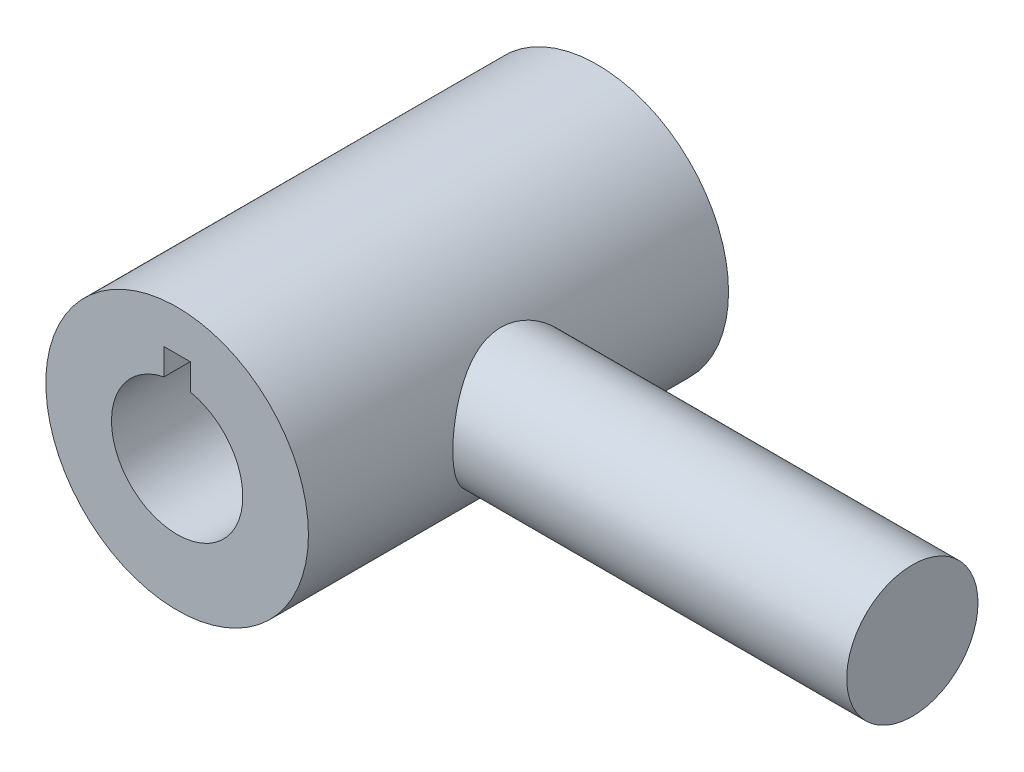
ISO-10303-21;
HEADER;
FILE_DESCRIPTION(('STEP AP214'),'2;1');
FILE_NAME('part.step','',(''),(''),'','','');
FILE_SCHEMA(('AUTOMOTIVE_DESIGN { 1 0 10303 214 1 1 1 1 }'));
ENDSEC;
DATA;
#1=APPLICATION_CONTEXT('core data for automotive mechanical design processes');
#2=APPLICATION_PROTOCOL_DEFINITION('international standard','automotive_design',2000,#1);
#3=PRODUCT_CONTEXT('',#1,'mechanical');
#4=PRODUCT('Part','Part','',(#3));
#5=PRODUCT_RELATED_PRODUCT_CATEGORY('part','',(#4));
#6=PRODUCT_DEFINITION_FORMATION('','',#4);
#7=PRODUCT_DEFINITION_CONTEXT('part definition',#1,'design');
#8=PRODUCT_DEFINITION('design','',#6,#7);
#9=PRODUCT_DEFINITION_SHAPE('','',#8);
#10=(LENGTH_UNIT() NAMED_UNIT(*) SI_UNIT(.MILLI.,.METRE.));
#11=(NAMED_UNIT(*) PLANE_ANGLE_UNIT() SI_UNIT($,.RADIAN.));
#12=(NAMED_UNIT(*) SI_UNIT($,.STERADIAN.) SOLID_ANGLE_UNIT());
#13=UNCERTAINTY_MEASURE_WITH_UNIT(LENGTH_MEASURE(1.E-05),#10,'distance_accuracy_value','');
#14=(GEOMETRIC_REPRESENTATION_CONTEXT(3) GLOBAL_UNCERTAINTY_ASSIGNED_CONTEXT((#13)) GLOBAL_UNIT_ASSIGNED_CONTEXT((#10,
#11,#12)) REPRESENTATION_CONTEXT('',''));
#15=CARTESIAN_POINT('',(0.,0.,0.));
#16=DIRECTION('',(0.,0.,1.));
#17=DIRECTION('',(1.,0.,0.));
#18=AXIS2_PLACEMENT_3D('',#15,#16,#17);
#19=CARTESIAN_POINT('',(0.,0.,10.16));
#20=DIRECTION('',(0.,0.,1.));
#21=DIRECTION('',(1.,0.,0.));
#22=AXIS2_PLACEMENT_3D('',#19,#20,#21);
#23=PLANE('',#22);
#24=CARTESIAN_POINT('',(0.,0.,10.16));
#25=DIRECTION('',(0.,0.,1.));
#26=DIRECTION('',(1.,0.,0.));
#27=AXIS2_PLACEMENT_3D('',#24,#25,#26);
#28=CIRCLE('',#27,6.35);
#29=CARTESIAN_POINT('',(6.35,0.,10.16));
#30=VERTEX_POINT('',#29);
#31=EDGE_CURVE('E11',#30,#30,#28,.T.);
#32=ORIENTED_EDGE('',*,*,#31,.T.);
#33=EDGE_LOOP('',(#32));
#34=FACE_BOUND('',#33,.T.);
#35=DIRECTION('',(0.,1.,0.));
#36=VECTOR('',#35,1.);
#37=CARTESIAN_POINT('',(0.635,4.38085197333464,10.16));
#38=LINE('',#37,#36);
#39=CARTESIAN_POINT('',(0.635,3.11085197333464,10.16));
#40=VERTEX_POINT('',#39);
#41=CARTESIAN_POINT('',(0.635,4.38085197333464,10.16));
#42=VERTEX_POINT('',#41);
#43=EDGE_CURVE('E100',#40,#42,#38,.T.);
#44=ORIENTED_EDGE('',*,*,#43,.F.);
#45=CARTESIAN_POINT('',(0.,0.,10.16));
#46=DIRECTION('',(0.,0.,1.));
#47=DIRECTION('',(1.,0.,0.));
#48=AXIS2_PLACEMENT_3D('',#45,#46,#47);
#49=CIRCLE('',#48,3.175);
#50=CARTESIAN_POINT('',(-0.635,3.11085197333464,10.16));
#51=VERTEX_POINT('',#50);
#52=EDGE_CURVE('E91',#51,#40,#49,.T.);
#53=ORIENTED_EDGE('',*,*,#52,.F.);
#54=DIRECTION('',(0.,-1.,0.));
#55=VECTOR('',#54,1.);
#56=CARTESIAN_POINT('',(-0.635,3.11085197333464,10.16));
#57=LINE('',#56,#55);
#58=CARTESIAN_POINT('',(-0.635,4.38085197333464,10.16));
#59=VERTEX_POINT('',#58);
#60=EDGE_CURVE('E118',#59,#51,#57,.T.);
#61=ORIENTED_EDGE('',*,*,#60,.F.);
#62=DIRECTION('',(-1.,0.,0.));
#63=VECTOR('',#62,1.);
#64=CARTESIAN_POINT('',(-0.635,4.38085197333464,10.16));
#65=LINE('',#64,#63);
#66=EDGE_CURVE('E112',#42,#59,#65,.T.);
#67=ORIENTED_EDGE('',*,*,#66,.F.);
#68=EDGE_LOOP('',(#44,#53,#61,#67));
#69=FACE_BOUND('',#68,.T.);
#70=ADVANCED_FACE('F49',(#34,#69),#23,.T.);
#71=CARTESIAN_POINT('',(0.,0.,-10.16));
#72=DIRECTION('',(0.,0.,1.));
#73=DIRECTION('',(1.,0.,0.));
#74=AXIS2_PLACEMENT_3D('',#71,#72,#73);
#75=PLANE('',#74);
#76=CARTESIAN_POINT('',(0.,0.,-10.16));
#77=DIRECTION('',(0.,0.,1.));
#78=DIRECTION('',(1.,0.,0.));
#79=AXIS2_PLACEMENT_3D('',#76,#77,#78);
#80=CIRCLE('',#79,6.35);
#81=CARTESIAN_POINT('',(6.35,0.,-10.16));
#82=VERTEX_POINT('',#81);
#83=EDGE_CURVE('E53',#82,#82,#80,.T.);
#84=ORIENTED_EDGE('',*,*,#83,.F.);
#85=EDGE_LOOP('',(#84));
#86=FACE_BOUND('',#85,.T.);
#87=CARTESIAN_POINT('',(0.,0.,-10.16));
#88=DIRECTION('',(0.,0.,1.));
#89=DIRECTION('',(1.,0.,0.));
#90=AXIS2_PLACEMENT_3D('',#87,#88,#89);
#91=CIRCLE('',#90,3.175);
#92=CARTESIAN_POINT('',(-0.635,3.11085197333464,-10.16));
#93=VERTEX_POINT('',#92);
#94=CARTESIAN_POINT('',(0.635,3.11085197333464,-10.16));
#95=VERTEX_POINT('',#94);
#96=EDGE_CURVE('E73',#93,#95,#91,.T.);
#97=ORIENTED_EDGE('',*,*,#96,.T.);
#98=DIRECTION('',(0.,1.,0.));
#99=VECTOR('',#98,1.);
#100=CARTESIAN_POINT('',(0.635,4.38085197333464,-10.16));
#101=LINE('',#100,#99);
#102=CARTESIAN_POINT('',(0.635,4.38085197333464,-10.16));
#103=VERTEX_POINT('',#102);
#104=EDGE_CURVE('E107',#95,#103,#101,.T.);
#105=ORIENTED_EDGE('',*,*,#104,.T.);
#106=DIRECTION('',(-1.,0.,0.));
#107=VECTOR('',#106,1.);
#108=CARTESIAN_POINT('',(-0.635,4.38085197333464,-10.16));
#109=LINE('',#108,#107);
#110=CARTESIAN_POINT('',(-0.635,4.38085197333464,-10.16));
#111=VERTEX_POINT('',#110);
#112=EDGE_CURVE('E129',#103,#111,#109,.T.);
#113=ORIENTED_EDGE('',*,*,#112,.T.);
#114=DIRECTION('',(0.,-1.,0.));
#115=VECTOR('',#114,1.);
#116=CARTESIAN_POINT('',(-0.635,3.11085197333464,-10.16));
#117=LINE('',#116,#115);
#118=EDGE_CURVE('E101',#111,#93,#117,.T.);
#119=ORIENTED_EDGE('',*,*,#118,.T.);
#120=EDGE_LOOP('',(#97,#105,#113,#119));
#121=FACE_BOUND('',#120,.T.);
#122=ADVANCED_FACE('F147',(#86,#121),#75,.F.);
#123=CARTESIAN_POINT('',(0.,0.,10.16));
#124=DIRECTION('',(0.,0.,-1.));
#125=DIRECTION('',(-1.,0.,0.));
#126=AXIS2_PLACEMENT_3D('',#123,#124,#125);
#127=CYLINDRICAL_SURFACE('',#126,6.35);
#128=CARTESIAN_POINT('',(6.35,0.,-3.175));
#129=CARTESIAN_POINT('',(6.34999931166444,0.0834969220594998,-3.17499911228237));
#130=CARTESIAN_POINT('',(6.34834758911701,0.167002655580042,-3.17170012555405));
#131=CARTESIAN_POINT('',(6.34179105821714,0.333378330258781,-3.15855412545011));
#132=CARTESIAN_POINT('',(6.33688483467113,0.416247978955771,-3.14870426347423));
#133=CARTESIAN_POINT('',(6.31742426748325,0.66318203064701,-3.10942793495399));
#134=CARTESIAN_POINT('',(6.29812827299425,0.825450146761554,-3.0702749225986));
#135=CARTESIAN_POINT('',(6.2489182313574,1.13965128900426,-2.96800928870585));
#136=CARTESIAN_POINT('',(6.21904547786825,1.29162180811868,-2.90498978075659));
#137=CARTESIAN_POINT('',(6.15142812041637,1.58264035037879,-2.7572639263711));
#138=CARTESIAN_POINT('',(6.11368413715877,1.72168939123018,-2.67255928984904));
#139=CARTESIAN_POINT('',(6.03111096182982,1.99234108848171,-2.47803037026578));
#140=CARTESIAN_POINT('',(5.98599127270818,2.12298433900091,-2.36699642220607));
#141=CARTESIAN_POINT('',(5.89470535591056,2.36467069069853,-2.12560331642721));
#142=CARTESIAN_POINT('',(5.84853836069043,2.47569885601321,-1.99522957023356));
#143=CARTESIAN_POINT('',(5.75623634934464,2.68368848497886,-1.70657905224669));
#144=CARTESIAN_POINT('',(5.71038146176788,2.77889135161934,-1.54692246869841));
#145=CARTESIAN_POINT('',(5.64919759286363,2.90019349951534,-1.29545201282557));
#146=CARTESIAN_POINT('',(5.63006420805933,2.93705266116892,-1.20959993817132));
#147=CARTESIAN_POINT('',(5.59504604853267,3.00322508739606,-1.03441438629358));
#148=CARTESIAN_POINT('',(5.57915935583429,3.03254280972159,-0.945083001819447));
#149=CARTESIAN_POINT('',(5.55212611635049,3.08174263292982,-0.768989448035257));
#150=CARTESIAN_POINT('',(5.54075429137746,3.10208128111978,-0.682389205971436));
#151=CARTESIAN_POINT('',(5.52193654886444,3.13545600360765,-0.507412721005601));
#152=CARTESIAN_POINT('',(5.51448854851135,3.14849595237257,-0.419037446228298));
#153=CARTESIAN_POINT('',(5.50383875782918,3.1670771305344,-0.241293261151383));
#154=CARTESIAN_POINT('',(5.50063441026522,3.1726228759965,-0.151924982012601));
#155=CARTESIAN_POINT('',(5.49859788398609,3.17614778806993,0.0269807841780854));
#156=CARTESIAN_POINT('',(5.49976528812799,3.17412767659872,0.116518254271338));
#157=CARTESIAN_POINT('',(5.50899190362733,3.1581193033026,0.362747875724405));
#158=CARTESIAN_POINT('',(5.52160857357707,3.13621253452965,0.518841729813365));
#159=CARTESIAN_POINT('',(5.55866493052824,3.07003746372168,0.82464664130653));
#160=CARTESIAN_POINT('',(5.58310838358077,3.02576203854504,0.974355649022765));
#161=CARTESIAN_POINT('',(5.64157885407237,2.91531509833647,1.26754429656414));
#162=CARTESIAN_POINT('',(5.67581583876129,2.84865758129418,1.41079760993662));
#163=CARTESIAN_POINT('',(5.75003268807633,2.69570761526054,1.68476608617402));
#164=CARTESIAN_POINT('',(5.79001512927804,2.60940634674629,1.81547557960851));
#165=CARTESIAN_POINT('',(5.87734289018611,2.40685964249565,2.07810427425029));
#166=CARTESIAN_POINT('',(5.92497898403936,2.28820488335253,2.20807538485651));
#167=CARTESIAN_POINT('',(6.01813700574905,2.03058898448427,2.44708514286384));
#168=CARTESIAN_POINT('',(6.06365791538158,1.89161819563546,2.5561137863587));
#169=CARTESIAN_POINT('',(6.1500381059768,1.58913989972483,2.75490191971972));
#170=CARTESIAN_POINT('',(6.19058274974572,1.42479265164789,2.84353148557994));
#171=CARTESIAN_POINT('',(6.25976272299952,1.08098023585583,2.99115808163535));
#172=CARTESIAN_POINT('',(6.28840750578946,0.901527205073897,3.05017864113171));
#173=CARTESIAN_POINT('',(6.32854759690358,0.548533610626835,3.13205940339905));
#174=CARTESIAN_POINT('',(6.34126679122995,0.375734359385247,3.15750967258734));
#175=CARTESIAN_POINT('',(6.35231817716325,0.0278752299448336,3.17965052226026));
#176=CARTESIAN_POINT('',(6.35065718436129,-0.147183538060017,3.17635472713932));
#177=CARTESIAN_POINT('',(6.33384535408399,-0.480164686080361,3.14259376405461));
#178=CARTESIAN_POINT('',(6.31975005060431,-0.638363620564188,3.11425420852516));
#179=CARTESIAN_POINT('',(6.28085393924121,-0.947441883052999,3.03454412179011));
#180=CARTESIAN_POINT('',(6.25605195113515,-1.09832040207141,2.98317105152272));
#181=CARTESIAN_POINT('',(6.19709998236334,-1.39347133182512,2.8575048690622));
#182=CARTESIAN_POINT('',(6.16270299610717,-1.53743151047822,2.78259841588881));
#183=CARTESIAN_POINT('',(6.08787118465664,-1.8112148234104,2.61268357431413));
#184=CARTESIAN_POINT('',(6.0474337895468,-1.94103189959927,2.5176666226146));
#185=CARTESIAN_POINT('',(5.95973602709939,-2.19636241342679,2.29946064962623));
#186=CARTESIAN_POINT('',(5.91219559251098,-2.3202013468198,2.17442139288844));
#187=CARTESIAN_POINT('',(5.81858093231368,-2.54589381918874,1.90523764485025));
#188=CARTESIAN_POINT('',(5.77250773963547,-2.6477321493525,1.76108004761907));
#189=CARTESIAN_POINT('',(5.68487535288742,-2.83117262876716,1.44893139804165));
#190=CARTESIAN_POINT('',(5.64364281441821,-2.91155594998014,1.28012423048962));
#191=CARTESIAN_POINT('',(5.5744767953732,-3.04191297152938,0.928655535110328));
#192=CARTESIAN_POINT('',(5.54652618900869,-3.0919258549222,0.746012202152618));
#193=CARTESIAN_POINT('',(5.51057765714603,-3.15551086037918,0.390810043529835));
#194=CARTESIAN_POINT('',(5.50092192343245,-3.17212027309711,0.218966249592789));
#195=CARTESIAN_POINT('',(5.49800001145358,-3.17718805563876,-0.125244442495203));
#196=CARTESIAN_POINT('',(5.5047267290444,-3.16565862768386,-0.297611081542637));
#197=CARTESIAN_POINT('',(5.53205211477784,-3.11761548073658,-0.620660103073908));
#198=CARTESIAN_POINT('',(5.55126823076269,-3.08358651207686,-0.771843941731147));
#199=CARTESIAN_POINT('',(5.59977978302582,-2.99458164828807,-1.06619083016717));
#200=CARTESIAN_POINT('',(5.62907846127335,-2.93959901505999,-1.2093512828503));
#201=CARTESIAN_POINT('',(5.69685576337174,-2.8061154442137,-1.49423369942854));
#202=CARTESIAN_POINT('',(5.73581889480533,-2.72628260503929,-1.63521280936567));
#203=CARTESIAN_POINT('',(5.81772207082382,-2.54682759156583,-1.9026974317231));
#204=CARTESIAN_POINT('',(5.8606641782013,-2.44719512169931,-2.02919535994271));
#205=CARTESIAN_POINT('',(5.95192753761203,-2.21680287661219,-2.28009752417706));
#206=CARTESIAN_POINT('',(6.00026839877346,-2.08373188558712,-2.40237975641279));
#207=CARTESIAN_POINT('',(6.0921234557675,-1.79751265125244,-2.62339787323312));
#208=CARTESIAN_POINT('',(6.13563504323042,-1.64435365457428,-2.72212106598272));
#209=CARTESIAN_POINT('',(6.19391073190243,-1.40178715704487,-2.85028026619707));
#210=CARTESIAN_POINT('',(6.21223173271383,-1.31842200030918,-2.88980058368139));
#211=CARTESIAN_POINT('',(6.24595363475604,-1.1480770102167,-2.9615994748237));
#212=CARTESIAN_POINT('',(6.26135597012704,-1.06109897786306,-2.99388160653437));
#213=CARTESIAN_POINT('',(6.28875097111981,-0.884361322813109,-3.050759345915));
#214=CARTESIAN_POINT('',(6.30075106809478,-0.794608244970573,-3.07537171813811));
#215=CARTESIAN_POINT('',(6.32100983571903,-0.612925661591583,-3.11666738952989));
#216=CARTESIAN_POINT('',(6.3292707916836,-0.520997521680291,-3.13335553219354));
#217=CARTESIAN_POINT('',(6.34032503263334,-0.357531347524374,-3.15561628486239));
#218=CARTESIAN_POINT('',(6.34394670812889,-0.286274046488595,-3.16287882124963));
#219=CARTESIAN_POINT('',(6.34878452045567,-0.143346668941345,-3.17257112653757));
#220=CARTESIAN_POINT('',(6.35000059089052,-0.0716765810914251,-3.17500076204683));
#221=CARTESIAN_POINT('',(6.35,0.,-3.175));
#222=B_SPLINE_CURVE_WITH_KNOTS('',3,(#128,#129,#130,#131,#132,#133,#134,#135,#136,#137,#138,
#139,#140,#141,#142,#143,#144,#145,#146,#147,#148,#149,#150,#151,#152,#153,#154,#155,#156,#157,
#158,#159,#160,#161,#162,#163,#164,#165,#166,#167,#168,#169,#170,#171,#172,#173,#174,#175,#176,
#177,#178,#179,#180,#181,#182,#183,#184,#185,#186,#187,#188,#189,#190,#191,#192,#193,#194,#195,
#196,#197,#198,#199,#200,#201,#202,#203,#204,#205,#206,#207,#208,#209,#210,#211,#212,#213,#214,
#215,#216,#217,#218,#219,#220,#221),.UNSPECIFIED.,.T.,.F.,(4,2,2,2,2,2,2,2,2,2,2,2,2,2,2,2,2,2,
2,2,2,2,2,2,2,2,2,2,2,2,2,2,2,2,2,2,2,2,2,2,2,2,2,2,2,2,4),(0.,0.25041561210268,
0.500940186864014,1.00234854488129,1.50182051324263,2.00125310940106,2.53090025348452,
3.06094897410615,3.63210298373098,3.91787290005988,4.20347350732849,4.47213270490102,
4.74064915090148,5.00900371453887,5.27733267302576,5.74927594687738,6.22136960256846,
6.70445970327764,7.18776712794021,7.73235646527881,8.27720530143646,8.84735553323666,
9.41705196489304,9.93956405039339,10.4618285011675,10.9436138594975,11.4254523397102,
11.9210677568139,12.4168946391879,12.9614122158798,13.5063050164601,14.0775857365549,
14.6481278321882,15.1639000911419,15.6794487286237,16.1458838633213,16.6124691169503,
17.1104020806943,17.6085946442304,18.1673210354482,18.7263477502426,19.0082017078365,
19.2899168101042,19.5710117490933,19.8519346536844,20.0668939492148,20.2818591776892),.UNSPECIFIED.);
#223=CARTESIAN_POINT('',(6.35,0.,-3.175));
#224=VERTEX_POINT('',#223);
#225=EDGE_CURVE('E126',#224,#224,#222,.T.);
#226=ORIENTED_EDGE('',*,*,#225,.F.);
#227=EDGE_LOOP('',(#226));
#228=FACE_BOUND('',#227,.T.);
#229=ORIENTED_EDGE('',*,*,#31,.F.);
#230=EDGE_LOOP('',(#229));
#231=FACE_BOUND('',#230,.T.);
#232=ORIENTED_EDGE('',*,*,#83,.T.);
#233=EDGE_LOOP('',(#232));
#234=FACE_BOUND('',#233,.T.);
#235=ADVANCED_FACE('F51',(#228,#231,#234),#127,.T.);
#236=CARTESIAN_POINT('',(0.,0.,10.16));
#237=DIRECTION('',(0.,0.,-1.));
#238=DIRECTION('',(-1.,0.,0.));
#239=AXIS2_PLACEMENT_3D('',#236,#237,#238);
#240=CYLINDRICAL_SURFACE('',#239,3.175);
#241=ORIENTED_EDGE('',*,*,#96,.F.);
#242=DIRECTION('',(0.,0.,-1.));
#243=VECTOR('',#242,1.);
#244=CARTESIAN_POINT('',(-0.635,3.11085197333464,10.16));
#245=LINE('',#244,#243);
#246=EDGE_CURVE('E95',#51,#93,#245,.T.);
#247=ORIENTED_EDGE('',*,*,#246,.F.);
#248=ORIENTED_EDGE('',*,*,#52,.T.);
#249=DIRECTION('',(0.,0.,-1.));
#250=VECTOR('',#249,1.);
#251=CARTESIAN_POINT('',(0.635,3.11085197333464,10.16));
#252=LINE('',#251,#250);
#253=EDGE_CURVE('E94',#40,#95,#252,.T.);
#254=ORIENTED_EDGE('',*,*,#253,.T.);
#255=EDGE_LOOP('',(#241,#247,#248,#254));
#256=FACE_BOUND('',#255,.T.);
#257=ADVANCED_FACE('F93',(#256),#240,.F.);
#258=CARTESIAN_POINT('',(0.635,4.38085197333464,10.16));
#259=DIRECTION('',(-1.,0.,0.));
#260=DIRECTION('',(0.,0.,1.));
#261=AXIS2_PLACEMENT_3D('',#258,#259,#260);
#262=PLANE('',#261);
#263=ORIENTED_EDGE('',*,*,#104,.F.);
#264=ORIENTED_EDGE('',*,*,#253,.F.);
#265=ORIENTED_EDGE('',*,*,#43,.T.);
#266=DIRECTION('',(0.,0.,-1.));
#267=VECTOR('',#266,1.);
#268=CARTESIAN_POINT('',(0.635,4.38085197333464,10.16));
#269=LINE('',#268,#267);
#270=EDGE_CURVE('E109',#42,#103,#269,.T.);
#271=ORIENTED_EDGE('',*,*,#270,.T.);
#272=EDGE_LOOP('',(#263,#264,#265,#271));
#273=FACE_BOUND('',#272,.T.);
#274=ADVANCED_FACE('F104',(#273),#262,.T.);
#275=CARTESIAN_POINT('',(-0.635,4.38085197333464,10.16));
#276=DIRECTION('',(0.,-1.,0.));
#277=DIRECTION('',(0.,0.,-1.));
#278=AXIS2_PLACEMENT_3D('',#275,#276,#277);
#279=PLANE('',#278);
#280=ORIENTED_EDGE('',*,*,#112,.F.);
#281=ORIENTED_EDGE('',*,*,#270,.F.);
#282=ORIENTED_EDGE('',*,*,#66,.T.);
#283=DIRECTION('',(0.,0.,-1.));
#284=VECTOR('',#283,1.);
#285=CARTESIAN_POINT('',(-0.635,4.38085197333464,10.16));
#286=LINE('',#285,#284);
#287=EDGE_CURVE('E65',#59,#111,#286,.T.);
#288=ORIENTED_EDGE('',*,*,#287,.T.);
#289=EDGE_LOOP('',(#280,#281,#282,#288));
#290=FACE_BOUND('',#289,.T.);
#291=ADVANCED_FACE('F145',(#290),#279,.T.);
#292=CARTESIAN_POINT('',(-0.635,3.11085197333464,10.16));
#293=DIRECTION('',(1.,0.,0.));
#294=DIRECTION('',(0.,0.,-1.));
#295=AXIS2_PLACEMENT_3D('',#292,#293,#294);
#296=PLANE('',#295);
#297=ORIENTED_EDGE('',*,*,#118,.F.);
#298=ORIENTED_EDGE('',*,*,#287,.F.);
#299=ORIENTED_EDGE('',*,*,#60,.T.);
#300=ORIENTED_EDGE('',*,*,#246,.T.);
#301=EDGE_LOOP('',(#297,#298,#299,#300));
#302=FACE_BOUND('',#301,.T.);
#303=ADVANCED_FACE('F148',(#302),#296,.T.);
#304=CARTESIAN_POINT('',(25.4,0.,0.));
#305=DIRECTION('',(1.,0.,0.));
#306=DIRECTION('',(0.,0.,-1.));
#307=AXIS2_PLACEMENT_3D('',#304,#305,#306);
#308=PLANE('',#307);
#309=CARTESIAN_POINT('',(25.4,0.,0.));
#310=DIRECTION('',(1.,0.,0.));
#311=DIRECTION('',(0.,0.,-1.));
#312=AXIS2_PLACEMENT_3D('',#309,#310,#311);
#313=CIRCLE('',#312,3.175);
#314=CARTESIAN_POINT('',(25.4,0.,-3.175));
#315=VERTEX_POINT('',#314);
#316=EDGE_CURVE('E214',#315,#315,#313,.T.);
#317=ORIENTED_EDGE('',*,*,#316,.T.);
#318=EDGE_LOOP('',(#317));
#319=FACE_BOUND('',#318,.T.);
#320=ADVANCED_FACE('F150',(#319),#308,.T.);
#321=CARTESIAN_POINT('',(-6.351,0.,0.));
#322=DIRECTION('',(1.,0.,0.));
#323=DIRECTION('',(0.,0.,-1.));
#324=AXIS2_PLACEMENT_3D('',#321,#322,#323);
#325=CYLINDRICAL_SURFACE('',#324,3.175);
#326=ORIENTED_EDGE('',*,*,#316,.F.);
#327=EDGE_LOOP('',(#326));
#328=FACE_BOUND('',#327,.T.);
#329=ORIENTED_EDGE('',*,*,#225,.T.);
#330=EDGE_LOOP('',(#329));
#331=FACE_BOUND('',#330,.T.);
#332=ADVANCED_FACE('F157',(#328,#331),#325,.T.);
#333=CLOSED_SHELL('',(#70,#122,#235,#257,#274,#291,#303,#320,#332));
#334=MANIFOLD_SOLID_BREP('B2',#333);
#335=ADVANCED_BREP_SHAPE_REPRESENTATION('',(#18,#334),#14);
#336=SHAPE_DEFINITION_REPRESENTATION(#9,#335);
ENDSEC;
END-ISO-10303-21;
